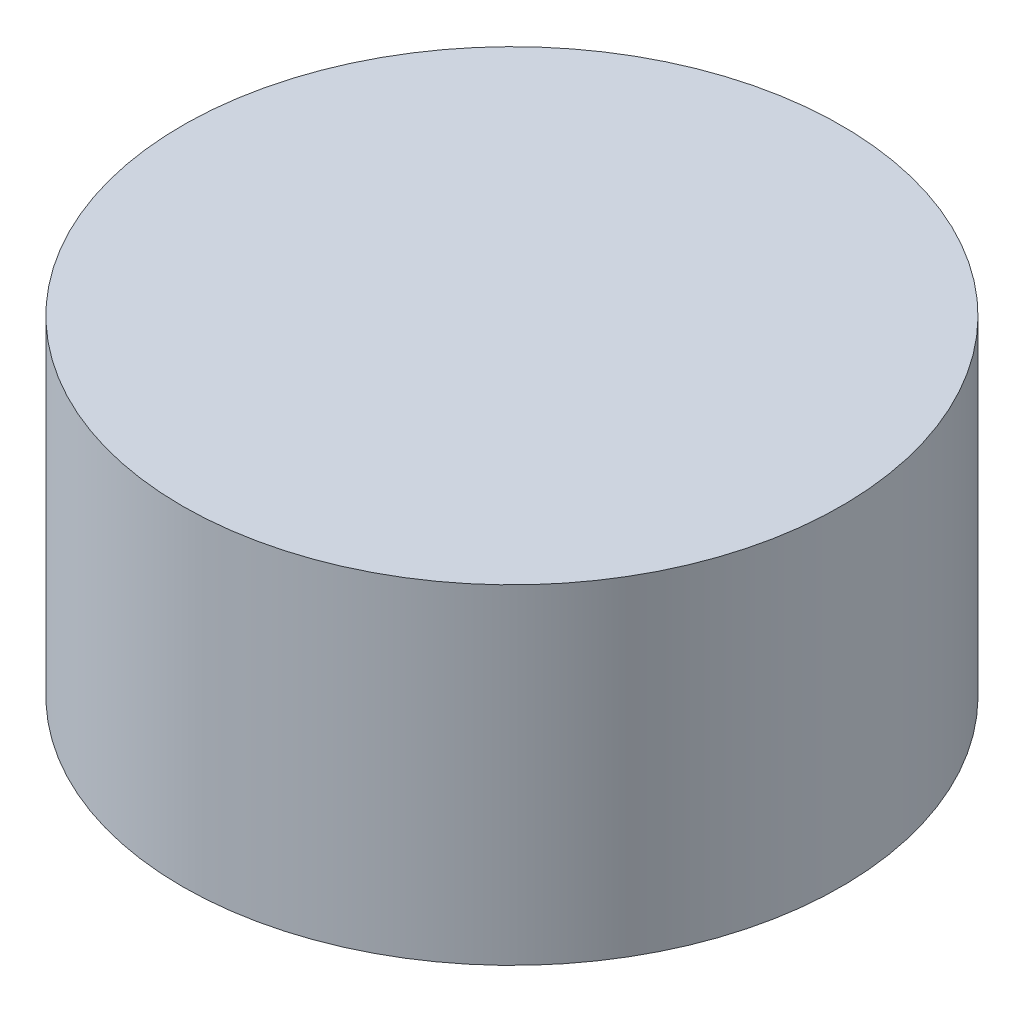
ISO-10303-21;
HEADER;
FILE_DESCRIPTION(('STEP AP214'),'2;1');
FILE_NAME('part.step','',(''),(''),'','','');
FILE_SCHEMA(('AUTOMOTIVE_DESIGN { 1 0 10303 214 1 1 1 1 }'));
ENDSEC;
DATA;
#1=APPLICATION_CONTEXT('core data for automotive mechanical design processes');
#2=APPLICATION_PROTOCOL_DEFINITION('international standard','automotive_design',2000,#1);
#3=PRODUCT_CONTEXT('',#1,'mechanical');
#4=PRODUCT('Part','Part','',(#3));
#5=PRODUCT_RELATED_PRODUCT_CATEGORY('part','',(#4));
#6=PRODUCT_DEFINITION_FORMATION('','',#4);
#7=PRODUCT_DEFINITION_CONTEXT('part definition',#1,'design');
#8=PRODUCT_DEFINITION('design','',#6,#7);
#9=PRODUCT_DEFINITION_SHAPE('','',#8);
#10=(LENGTH_UNIT() NAMED_UNIT(*) SI_UNIT(.MILLI.,.METRE.));
#11=(NAMED_UNIT(*) PLANE_ANGLE_UNIT() SI_UNIT($,.RADIAN.));
#12=(NAMED_UNIT(*) SI_UNIT($,.STERADIAN.) SOLID_ANGLE_UNIT());
#13=UNCERTAINTY_MEASURE_WITH_UNIT(LENGTH_MEASURE(1.E-05),#10,'distance_accuracy_value','');
#14=(GEOMETRIC_REPRESENTATION_CONTEXT(3) GLOBAL_UNCERTAINTY_ASSIGNED_CONTEXT((#13)) GLOBAL_UNIT_ASSIGNED_CONTEXT((#10,
#11,#12)) REPRESENTATION_CONTEXT('',''));
#15=CARTESIAN_POINT('',(0.,0.,0.));
#16=DIRECTION('',(0.,0.,1.));
#17=DIRECTION('',(1.,0.,0.));
#18=AXIS2_PLACEMENT_3D('',#15,#16,#17);
#19=CARTESIAN_POINT('',(0.,3.5,0.));
#20=DIRECTION('',(0.,-1.,0.));
#21=DIRECTION('',(0.,0.,-1.));
#22=AXIS2_PLACEMENT_3D('',#19,#20,#21);
#23=CYLINDRICAL_SURFACE('',#22,3.5);
#24=CARTESIAN_POINT('',(0.,3.5,0.));
#25=DIRECTION('',(0.,1.,0.));
#26=DIRECTION('',(0.,0.,1.));
#27=AXIS2_PLACEMENT_3D('',#24,#25,#26);
#28=CIRCLE('',#27,3.5);
#29=CARTESIAN_POINT('',(0.,3.5,3.5));
#30=VERTEX_POINT('',#29);
#31=EDGE_CURVE('E10',#30,#30,#28,.T.);
#32=ORIENTED_EDGE('',*,*,#31,.F.);
#33=EDGE_LOOP('',(#32));
#34=FACE_BOUND('',#33,.T.);
#35=CARTESIAN_POINT('',(0.,0.,0.));
#36=DIRECTION('',(0.,1.,0.));
#37=DIRECTION('',(0.,0.,1.));
#38=AXIS2_PLACEMENT_3D('',#35,#36,#37);
#39=CIRCLE('',#38,3.5);
#40=CARTESIAN_POINT('',(0.,0.,3.5));
#41=VERTEX_POINT('',#40);
#42=EDGE_CURVE('E40',#41,#41,#39,.T.);
#43=ORIENTED_EDGE('',*,*,#42,.T.);
#44=EDGE_LOOP('',(#43));
#45=FACE_BOUND('',#44,.T.);
#46=ADVANCED_FACE('F37',(#34,#45),#23,.T.);
#47=CARTESIAN_POINT('',(0.,3.5,0.));
#48=DIRECTION('',(0.,1.,0.));
#49=DIRECTION('',(0.,0.,1.));
#50=AXIS2_PLACEMENT_3D('',#47,#48,#49);
#51=PLANE('',#50);
#52=ORIENTED_EDGE('',*,*,#31,.T.);
#53=EDGE_LOOP('',(#52));
#54=FACE_BOUND('',#53,.T.);
#55=ADVANCED_FACE('F52',(#54),#51,.T.);
#56=CARTESIAN_POINT('',(0.,0.,0.));
#57=DIRECTION('',(0.,1.,0.));
#58=DIRECTION('',(0.,0.,1.));
#59=AXIS2_PLACEMENT_3D('',#56,#57,#58);
#60=PLANE('',#59);
#61=ORIENTED_EDGE('',*,*,#42,.F.);
#62=EDGE_LOOP('',(#61));
#63=FACE_BOUND('',#62,.T.);
#64=ADVANCED_FACE('F50',(#63),#60,.F.);
#65=CLOSED_SHELL('',(#46,#55,#64));
#66=MANIFOLD_SOLID_BREP('B2',#65);
#67=ADVANCED_BREP_SHAPE_REPRESENTATION('',(#18,#66),#14);
#68=SHAPE_DEFINITION_REPRESENTATION(#9,#67);
ENDSEC;
END-ISO-10303-21;
